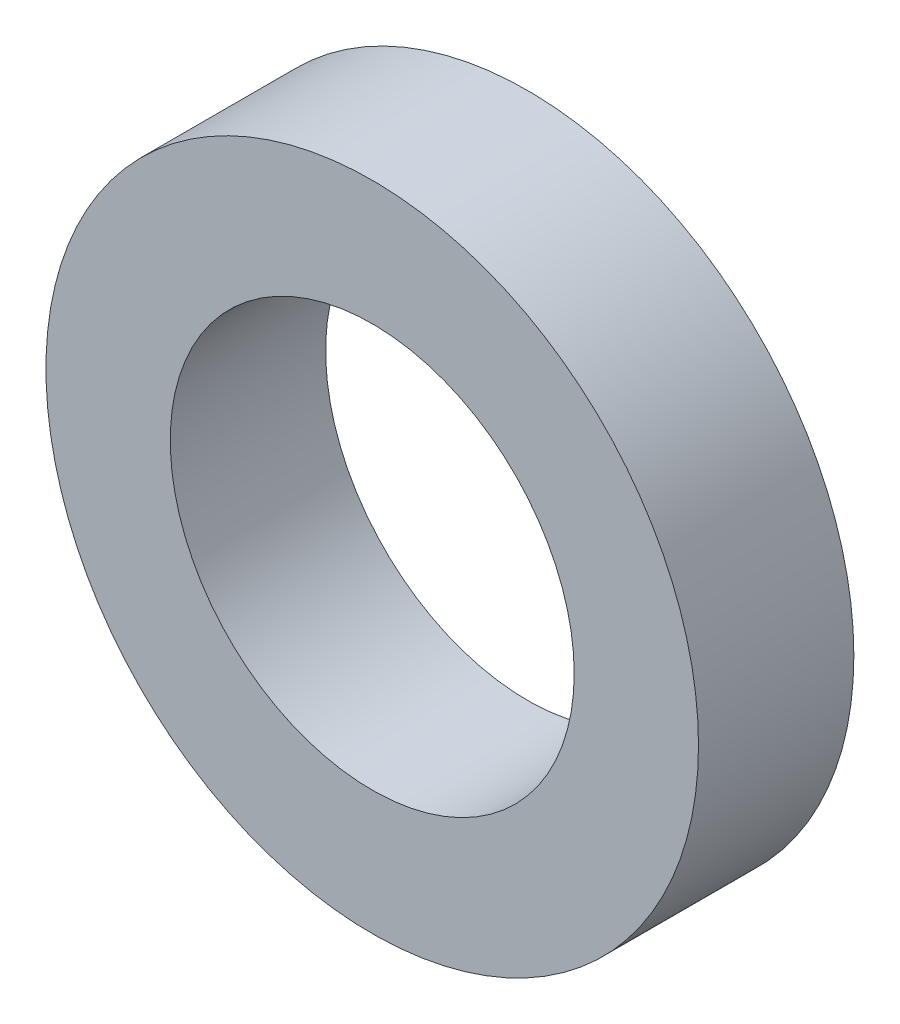
ISO-10303-21;
HEADER;
FILE_DESCRIPTION(('STEP AP214'),'2;1');
FILE_NAME('part.step','',(''),(''),'','','');
FILE_SCHEMA(('AUTOMOTIVE_DESIGN { 1 0 10303 214 1 1 1 1 }'));
ENDSEC;
DATA;
#1=APPLICATION_CONTEXT('core data for automotive mechanical design processes');
#2=APPLICATION_PROTOCOL_DEFINITION('international standard','automotive_design',2000,#1);
#3=PRODUCT_CONTEXT('',#1,'mechanical');
#4=PRODUCT('Part','Part','',(#3));
#5=PRODUCT_RELATED_PRODUCT_CATEGORY('part','',(#4));
#6=PRODUCT_DEFINITION_FORMATION('','',#4);
#7=PRODUCT_DEFINITION_CONTEXT('part definition',#1,'design');
#8=PRODUCT_DEFINITION('design','',#6,#7);
#9=PRODUCT_DEFINITION_SHAPE('','',#8);
#10=(LENGTH_UNIT() NAMED_UNIT(*) SI_UNIT(.MILLI.,.METRE.));
#11=(NAMED_UNIT(*) PLANE_ANGLE_UNIT() SI_UNIT($,.RADIAN.));
#12=(NAMED_UNIT(*) SI_UNIT($,.STERADIAN.) SOLID_ANGLE_UNIT());
#13=UNCERTAINTY_MEASURE_WITH_UNIT(LENGTH_MEASURE(1.E-05),#10,'distance_accuracy_value','');
#14=(GEOMETRIC_REPRESENTATION_CONTEXT(3) GLOBAL_UNCERTAINTY_ASSIGNED_CONTEXT((#13)) GLOBAL_UNIT_ASSIGNED_CONTEXT((#10,
#11,#12)) REPRESENTATION_CONTEXT('',''));
#15=CARTESIAN_POINT('',(0.,0.,0.));
#16=DIRECTION('',(0.,0.,1.));
#17=DIRECTION('',(1.,0.,0.));
#18=AXIS2_PLACEMENT_3D('',#15,#16,#17);
#19=CARTESIAN_POINT('',(0.,0.,5000.));
#20=DIRECTION('',(0.,0.,1.));
#21=DIRECTION('',(1.,0.,0.));
#22=AXIS2_PLACEMENT_3D('',#19,#20,#21);
#23=PLANE('',#22);
#24=CARTESIAN_POINT('',(0.,0.,5000.));
#25=DIRECTION('',(0.,0.,1.));
#26=DIRECTION('',(1.,0.,0.));
#27=AXIS2_PLACEMENT_3D('',#24,#25,#26);
#28=CIRCLE('',#27,10500.);
#29=CARTESIAN_POINT('',(10500.,0.,5000.));
#30=VERTEX_POINT('',#29);
#31=EDGE_CURVE('E10',#30,#30,#28,.T.);
#32=ORIENTED_EDGE('',*,*,#31,.T.);
#33=EDGE_LOOP('',(#32));
#34=FACE_BOUND('',#33,.T.);
#35=CARTESIAN_POINT('',(0.,0.,5000.));
#36=DIRECTION('',(0.,0.,1.));
#37=DIRECTION('',(1.,0.,0.));
#38=AXIS2_PLACEMENT_3D('',#35,#36,#37);
#39=CIRCLE('',#38,6500.);
#40=CARTESIAN_POINT('',(6500.,0.,5000.));
#41=VERTEX_POINT('',#40);
#42=EDGE_CURVE('E44',#41,#41,#39,.T.);
#43=ORIENTED_EDGE('',*,*,#42,.F.);
#44=EDGE_LOOP('',(#43));
#45=FACE_BOUND('',#44,.T.);
#46=ADVANCED_FACE('F33',(#34,#45),#23,.T.);
#47=CARTESIAN_POINT('',(0.,0.,0.));
#48=DIRECTION('',(0.,0.,1.));
#49=DIRECTION('',(1.,0.,0.));
#50=AXIS2_PLACEMENT_3D('',#47,#48,#49);
#51=PLANE('',#50);
#52=CARTESIAN_POINT('',(0.,0.,0.));
#53=DIRECTION('',(0.,0.,1.));
#54=DIRECTION('',(1.,0.,0.));
#55=AXIS2_PLACEMENT_3D('',#52,#53,#54);
#56=CIRCLE('',#55,10500.);
#57=CARTESIAN_POINT('',(10500.,0.,0.));
#58=VERTEX_POINT('',#57);
#59=EDGE_CURVE('E37',#58,#58,#56,.T.);
#60=ORIENTED_EDGE('',*,*,#59,.F.);
#61=EDGE_LOOP('',(#60));
#62=FACE_BOUND('',#61,.T.);
#63=CARTESIAN_POINT('',(0.,0.,0.));
#64=DIRECTION('',(0.,0.,1.));
#65=DIRECTION('',(1.,0.,0.));
#66=AXIS2_PLACEMENT_3D('',#63,#64,#65);
#67=CIRCLE('',#66,6500.);
#68=CARTESIAN_POINT('',(6500.,0.,0.));
#69=VERTEX_POINT('',#68);
#70=EDGE_CURVE('E46',#69,#69,#67,.T.);
#71=ORIENTED_EDGE('',*,*,#70,.T.);
#72=EDGE_LOOP('',(#71));
#73=FACE_BOUND('',#72,.T.);
#74=ADVANCED_FACE('F56',(#62,#73),#51,.F.);
#75=CARTESIAN_POINT('',(0.,0.,5000.));
#76=DIRECTION('',(0.,0.,-1.));
#77=DIRECTION('',(-1.,0.,0.));
#78=AXIS2_PLACEMENT_3D('',#75,#76,#77);
#79=CYLINDRICAL_SURFACE('',#78,10500.);
#80=ORIENTED_EDGE('',*,*,#31,.F.);
#81=EDGE_LOOP('',(#80));
#82=FACE_BOUND('',#81,.T.);
#83=ORIENTED_EDGE('',*,*,#59,.T.);
#84=EDGE_LOOP('',(#83));
#85=FACE_BOUND('',#84,.T.);
#86=ADVANCED_FACE('F35',(#82,#85),#79,.T.);
#87=CARTESIAN_POINT('',(0.,0.,5000.));
#88=DIRECTION('',(0.,0.,-1.));
#89=DIRECTION('',(-1.,0.,0.));
#90=AXIS2_PLACEMENT_3D('',#87,#88,#89);
#91=CYLINDRICAL_SURFACE('',#90,6500.);
#92=ORIENTED_EDGE('',*,*,#42,.T.);
#93=EDGE_LOOP('',(#92));
#94=FACE_BOUND('',#93,.T.);
#95=ORIENTED_EDGE('',*,*,#70,.F.);
#96=EDGE_LOOP('',(#95));
#97=FACE_BOUND('',#96,.T.);
#98=ADVANCED_FACE('F52',(#94,#97),#91,.F.);
#99=CLOSED_SHELL('',(#46,#74,#86,#98));
#100=MANIFOLD_SOLID_BREP('B2',#99);
#101=ADVANCED_BREP_SHAPE_REPRESENTATION('',(#18,#100),#14);
#102=SHAPE_DEFINITION_REPRESENTATION(#9,#101);
ENDSEC;
END-ISO-10303-21;
